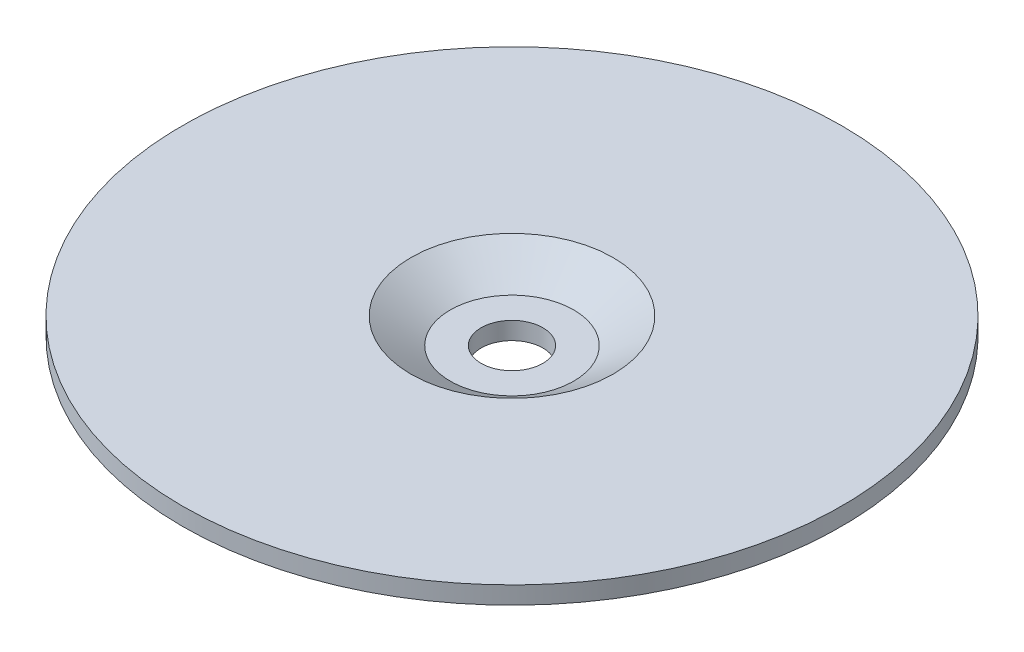
ISO-10303-21;
HEADER;
FILE_DESCRIPTION(('STEP AP214'),'2;1');
FILE_NAME('part.step','',(''),(''),'','','');
FILE_SCHEMA(('AUTOMOTIVE_DESIGN { 1 0 10303 214 1 1 1 1 }'));
ENDSEC;
DATA;
#1=APPLICATION_CONTEXT('core data for automotive mechanical design processes');
#2=APPLICATION_PROTOCOL_DEFINITION('international standard','automotive_design',2000,#1);
#3=PRODUCT_CONTEXT('',#1,'mechanical');
#4=PRODUCT('Part','Part','',(#3));
#5=PRODUCT_RELATED_PRODUCT_CATEGORY('part','',(#4));
#6=PRODUCT_DEFINITION_FORMATION('','',#4);
#7=PRODUCT_DEFINITION_CONTEXT('part definition',#1,'design');
#8=PRODUCT_DEFINITION('design','',#6,#7);
#9=PRODUCT_DEFINITION_SHAPE('','',#8);
#10=(LENGTH_UNIT() NAMED_UNIT(*) SI_UNIT(.MILLI.,.METRE.));
#11=(NAMED_UNIT(*) PLANE_ANGLE_UNIT() SI_UNIT($,.RADIAN.));
#12=(NAMED_UNIT(*) SI_UNIT($,.STERADIAN.) SOLID_ANGLE_UNIT());
#13=UNCERTAINTY_MEASURE_WITH_UNIT(LENGTH_MEASURE(1.E-05),#10,'distance_accuracy_value','');
#14=(GEOMETRIC_REPRESENTATION_CONTEXT(3) GLOBAL_UNCERTAINTY_ASSIGNED_CONTEXT((#13)) GLOBAL_UNIT_ASSIGNED_CONTEXT((#10,
#11,#12)) REPRESENTATION_CONTEXT('',''));
#15=CARTESIAN_POINT('',(0.,0.,0.));
#16=DIRECTION('',(0.,0.,1.));
#17=DIRECTION('',(1.,0.,0.));
#18=AXIS2_PLACEMENT_3D('',#15,#16,#17);
#19=CARTESIAN_POINT('',(-3.5687,2.032,0.));
#20=DIRECTION('',(0.,-1.,0.));
#21=DIRECTION('',(0.,0.,-1.));
#22=AXIS2_PLACEMENT_3D('',#19,#20,#21);
#23=PLANE('',#22);
#24=CARTESIAN_POINT('',(0.,2.032,0.));
#25=DIRECTION('',(0.,-1.,0.));
#26=DIRECTION('',(0.,0.,-1.));
#27=AXIS2_PLACEMENT_3D('',#24,#25,#26);
#28=CIRCLE('',#27,7.1374);
#29=CARTESIAN_POINT('',(0.,2.032,-7.1374));
#30=VERTEX_POINT('',#29);
#31=EDGE_CURVE('E60',#30,#30,#28,.T.);
#32=ORIENTED_EDGE('',*,*,#31,.F.);
#33=EDGE_LOOP('',(#32));
#34=FACE_BOUND('',#33,.T.);
#35=CARTESIAN_POINT('',(0.,2.032,0.));
#36=DIRECTION('',(0.,-1.,0.));
#37=DIRECTION('',(0.,0.,-1.));
#38=AXIS2_PLACEMENT_3D('',#35,#36,#37);
#39=CIRCLE('',#38,3.5687);
#40=CARTESIAN_POINT('',(0.,2.032,-3.5687));
#41=VERTEX_POINT('',#40);
#42=EDGE_CURVE('E10',#41,#41,#39,.T.);
#43=ORIENTED_EDGE('',*,*,#42,.T.);
#44=EDGE_LOOP('',(#43));
#45=FACE_BOUND('',#44,.T.);
#46=ADVANCED_FACE('F32',(#34,#45),#23,.F.);
#47=CARTESIAN_POINT('',(0.,0.,0.));
#48=DIRECTION('',(0.,-1.,0.));
#49=DIRECTION('',(0.,0.,-1.));
#50=AXIS2_PLACEMENT_3D('',#47,#48,#49);
#51=CYLINDRICAL_SURFACE('',#50,3.5687);
#52=ORIENTED_EDGE('',*,*,#42,.F.);
#53=EDGE_LOOP('',(#52));
#54=FACE_BOUND('',#53,.T.);
#55=CARTESIAN_POINT('',(0.,0.,0.));
#56=DIRECTION('',(0.,-1.,0.));
#57=DIRECTION('',(0.,0.,-1.));
#58=AXIS2_PLACEMENT_3D('',#55,#56,#57);
#59=CIRCLE('',#58,3.5687);
#60=CARTESIAN_POINT('',(0.,0.,-3.5687));
#61=VERTEX_POINT('',#60);
#62=EDGE_CURVE('E38',#61,#61,#59,.T.);
#63=ORIENTED_EDGE('',*,*,#62,.T.);
#64=EDGE_LOOP('',(#63));
#65=FACE_BOUND('',#64,.T.);
#66=ADVANCED_FACE('F67',(#54,#65),#51,.F.);
#67=CARTESIAN_POINT('',(-7.1374,0.,0.));
#68=DIRECTION('',(0.,1.,0.));
#69=DIRECTION('',(0.,0.,1.));
#70=AXIS2_PLACEMENT_3D('',#67,#68,#69);
#71=PLANE('',#70);
#72=ORIENTED_EDGE('',*,*,#62,.F.);
#73=EDGE_LOOP('',(#72));
#74=FACE_BOUND('',#73,.T.);
#75=CARTESIAN_POINT('',(0.,0.,0.));
#76=DIRECTION('',(0.,-1.,0.));
#77=DIRECTION('',(0.,0.,-1.));
#78=AXIS2_PLACEMENT_3D('',#75,#76,#77);
#79=CIRCLE('',#78,7.1374);
#80=CARTESIAN_POINT('',(0.,0.,-7.1374));
#81=VERTEX_POINT('',#80);
#82=EDGE_CURVE('E42',#81,#81,#79,.T.);
#83=ORIENTED_EDGE('',*,*,#82,.T.);
#84=EDGE_LOOP('',(#83));
#85=FACE_BOUND('',#84,.T.);
#86=ADVANCED_FACE('F71',(#74,#85),#71,.F.);
#87=CARTESIAN_POINT('',(0.,2.9718,0.));
#88=DIRECTION('',(0.,1.,0.));
#89=DIRECTION('',(0.,0.,1.));
#90=AXIS2_PLACEMENT_3D('',#87,#88,#89);
#91=CONICAL_SURFACE('',#90,11.684,0.991872591823139);
#92=ORIENTED_EDGE('',*,*,#82,.F.);
#93=EDGE_LOOP('',(#92));
#94=FACE_BOUND('',#93,.T.);
#95=CARTESIAN_POINT('',(0.,2.9718,0.));
#96=DIRECTION('',(0.,-1.,0.));
#97=DIRECTION('',(0.,0.,-1.));
#98=AXIS2_PLACEMENT_3D('',#95,#96,#97);
#99=CIRCLE('',#98,11.684);
#100=CARTESIAN_POINT('',(0.,2.9718,-11.684));
#101=VERTEX_POINT('',#100);
#102=EDGE_CURVE('E46',#101,#101,#99,.T.);
#103=ORIENTED_EDGE('',*,*,#102,.T.);
#104=EDGE_LOOP('',(#103));
#105=FACE_BOUND('',#104,.T.);
#106=ADVANCED_FACE('F76',(#94,#105),#91,.T.);
#107=CARTESIAN_POINT('',(-38.1,2.9718,0.));
#108=DIRECTION('',(0.,1.,0.));
#109=DIRECTION('',(0.,0.,1.));
#110=AXIS2_PLACEMENT_3D('',#107,#108,#109);
#111=PLANE('',#110);
#112=ORIENTED_EDGE('',*,*,#102,.F.);
#113=EDGE_LOOP('',(#112));
#114=FACE_BOUND('',#113,.T.);
#115=CARTESIAN_POINT('',(0.,2.9718,0.));
#116=DIRECTION('',(0.,-1.,0.));
#117=DIRECTION('',(0.,0.,-1.));
#118=AXIS2_PLACEMENT_3D('',#115,#116,#117);
#119=CIRCLE('',#118,38.1);
#120=CARTESIAN_POINT('',(0.,2.9718,-38.1));
#121=VERTEX_POINT('',#120);
#122=EDGE_CURVE('E51',#121,#121,#119,.T.);
#123=ORIENTED_EDGE('',*,*,#122,.T.);
#124=EDGE_LOOP('',(#123));
#125=FACE_BOUND('',#124,.T.);
#126=ADVANCED_FACE('F82',(#114,#125),#111,.F.);
#127=CARTESIAN_POINT('',(0.,0.,0.));
#128=DIRECTION('',(0.,-1.,0.));
#129=DIRECTION('',(0.,0.,-1.));
#130=AXIS2_PLACEMENT_3D('',#127,#128,#129);
#131=CYLINDRICAL_SURFACE('',#130,38.1);
#132=ORIENTED_EDGE('',*,*,#122,.F.);
#133=EDGE_LOOP('',(#132));
#134=FACE_BOUND('',#133,.T.);
#135=CARTESIAN_POINT('',(0.,5.0038,0.));
#136=DIRECTION('',(0.,-1.,0.));
#137=DIRECTION('',(0.,0.,-1.));
#138=AXIS2_PLACEMENT_3D('',#135,#136,#137);
#139=CIRCLE('',#138,38.1);
#140=CARTESIAN_POINT('',(0.,5.0038,-38.1));
#141=VERTEX_POINT('',#140);
#142=EDGE_CURVE('E54',#141,#141,#139,.T.);
#143=ORIENTED_EDGE('',*,*,#142,.T.);
#144=EDGE_LOOP('',(#143));
#145=FACE_BOUND('',#144,.T.);
#146=ADVANCED_FACE('F86',(#134,#145),#131,.T.);
#147=CARTESIAN_POINT('',(-11.684,5.0038,0.));
#148=DIRECTION('',(0.,-1.,0.));
#149=DIRECTION('',(0.,0.,-1.));
#150=AXIS2_PLACEMENT_3D('',#147,#148,#149);
#151=PLANE('',#150);
#152=ORIENTED_EDGE('',*,*,#142,.F.);
#153=EDGE_LOOP('',(#152));
#154=FACE_BOUND('',#153,.T.);
#155=CARTESIAN_POINT('',(0.,5.0038,0.));
#156=DIRECTION('',(0.,-1.,0.));
#157=DIRECTION('',(0.,0.,-1.));
#158=AXIS2_PLACEMENT_3D('',#155,#156,#157);
#159=CIRCLE('',#158,11.684);
#160=CARTESIAN_POINT('',(0.,5.0038,-11.684));
#161=VERTEX_POINT('',#160);
#162=EDGE_CURVE('E57',#161,#161,#159,.T.);
#163=ORIENTED_EDGE('',*,*,#162,.T.);
#164=EDGE_LOOP('',(#163));
#165=FACE_BOUND('',#164,.T.);
#166=ADVANCED_FACE('F90',(#154,#165),#151,.F.);
#167=CARTESIAN_POINT('',(0.,2.032,0.));
#168=DIRECTION('',(0.,1.,0.));
#169=DIRECTION('',(0.,0.,1.));
#170=AXIS2_PLACEMENT_3D('',#167,#168,#169);
#171=CONICAL_SURFACE('',#170,7.1374,0.991872591823139);
#172=ORIENTED_EDGE('',*,*,#162,.F.);
#173=EDGE_LOOP('',(#172));
#174=FACE_BOUND('',#173,.T.);
#175=ORIENTED_EDGE('',*,*,#31,.T.);
#176=EDGE_LOOP('',(#175));
#177=FACE_BOUND('',#176,.T.);
#178=ADVANCED_FACE('F64',(#174,#177),#171,.F.);
#179=CLOSED_SHELL('',(#46,#66,#86,#106,#126,#146,#166,#178));
#180=MANIFOLD_SOLID_BREP('B2',#179);
#181=ADVANCED_BREP_SHAPE_REPRESENTATION('',(#18,#180),#14);
#182=SHAPE_DEFINITION_REPRESENTATION(#9,#181);
ENDSEC;
END-ISO-10303-21;
